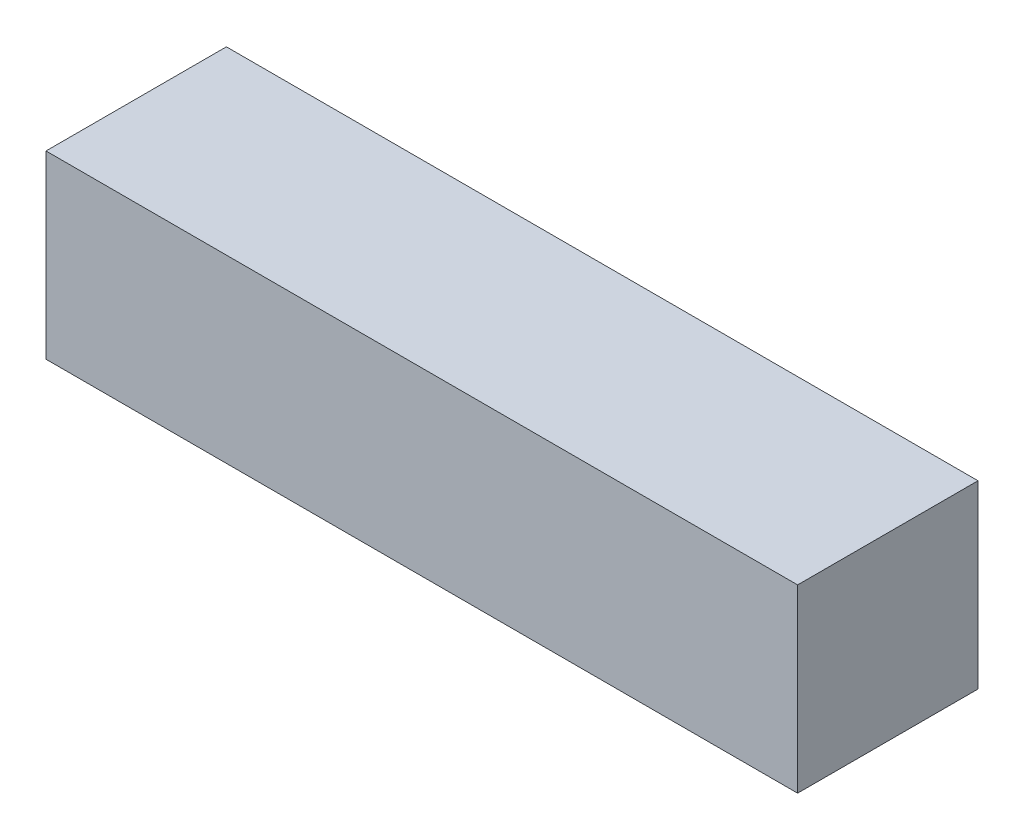
ISO-10303-21;
HEADER;
FILE_DESCRIPTION(('STEP AP214'),'2;1');
FILE_NAME('part.step','',(''),(''),'','','');
FILE_SCHEMA(('AUTOMOTIVE_DESIGN { 1 0 10303 214 1 1 1 1 }'));
ENDSEC;
DATA;
#1=APPLICATION_CONTEXT('core data for automotive mechanical design processes');
#2=APPLICATION_PROTOCOL_DEFINITION('international standard','automotive_design',2000,#1);
#3=PRODUCT_CONTEXT('',#1,'mechanical');
#4=PRODUCT('Part','Part','',(#3));
#5=PRODUCT_RELATED_PRODUCT_CATEGORY('part','',(#4));
#6=PRODUCT_DEFINITION_FORMATION('','',#4);
#7=PRODUCT_DEFINITION_CONTEXT('part definition',#1,'design');
#8=PRODUCT_DEFINITION('design','',#6,#7);
#9=PRODUCT_DEFINITION_SHAPE('','',#8);
#10=(LENGTH_UNIT() NAMED_UNIT(*) SI_UNIT(.MILLI.,.METRE.));
#11=(NAMED_UNIT(*) PLANE_ANGLE_UNIT() SI_UNIT($,.RADIAN.));
#12=(NAMED_UNIT(*) SI_UNIT($,.STERADIAN.) SOLID_ANGLE_UNIT());
#13=UNCERTAINTY_MEASURE_WITH_UNIT(LENGTH_MEASURE(1.E-05),#10,'distance_accuracy_value','');
#14=(GEOMETRIC_REPRESENTATION_CONTEXT(3) GLOBAL_UNCERTAINTY_ASSIGNED_CONTEXT((#13)) GLOBAL_UNIT_ASSIGNED_CONTEXT((#10,
#11,#12)) REPRESENTATION_CONTEXT('',''));
#15=CARTESIAN_POINT('',(0.,0.,0.));
#16=DIRECTION('',(0.,0.,1.));
#17=DIRECTION('',(1.,0.,0.));
#18=AXIS2_PLACEMENT_3D('',#15,#16,#17);
#19=CARTESIAN_POINT('',(0.,30.,0.));
#20=DIRECTION('',(1.,0.,0.));
#21=DIRECTION('',(0.,0.,-1.));
#22=AXIS2_PLACEMENT_3D('',#19,#20,#21);
#23=PLANE('',#22);
#24=DIRECTION('',(0.,0.,1.));
#25=VECTOR('',#24,1.);
#26=CARTESIAN_POINT('',(0.,0.,0.));
#27=LINE('',#26,#25);
#28=CARTESIAN_POINT('',(0.,0.,-30.));
#29=VERTEX_POINT('',#28);
#30=CARTESIAN_POINT('',(0.,0.,0.));
#31=VERTEX_POINT('',#30);
#32=EDGE_CURVE('E96',#29,#31,#27,.T.);
#33=ORIENTED_EDGE('',*,*,#32,.T.);
#34=DIRECTION('',(0.,-1.,0.));
#35=VECTOR('',#34,1.);
#36=CARTESIAN_POINT('',(0.,30.,0.));
#37=LINE('',#36,#35);
#38=CARTESIAN_POINT('',(0.,30.,0.));
#39=VERTEX_POINT('',#38);
#40=EDGE_CURVE('E11',#39,#31,#37,.T.);
#41=ORIENTED_EDGE('',*,*,#40,.F.);
#42=DIRECTION('',(0.,0.,1.));
#43=VECTOR('',#42,1.);
#44=CARTESIAN_POINT('',(0.,30.,0.));
#45=LINE('',#44,#43);
#46=CARTESIAN_POINT('',(0.,30.,-30.));
#47=VERTEX_POINT('',#46);
#48=EDGE_CURVE('E84',#47,#39,#45,.T.);
#49=ORIENTED_EDGE('',*,*,#48,.F.);
#50=DIRECTION('',(0.,-1.,0.));
#51=VECTOR('',#50,1.);
#52=CARTESIAN_POINT('',(0.,30.,-30.));
#53=LINE('',#52,#51);
#54=EDGE_CURVE('E92',#47,#29,#53,.T.);
#55=ORIENTED_EDGE('',*,*,#54,.T.);
#56=EDGE_LOOP('',(#33,#41,#49,#55));
#57=FACE_BOUND('',#56,.T.);
#58=ADVANCED_FACE('F33',(#57),#23,.F.);
#59=CARTESIAN_POINT('',(0.,30.,0.));
#60=DIRECTION('',(0.,0.,-1.));
#61=DIRECTION('',(-1.,0.,0.));
#62=AXIS2_PLACEMENT_3D('',#59,#60,#61);
#63=PLANE('',#62);
#64=DIRECTION('',(1.,0.,0.));
#65=VECTOR('',#64,1.);
#66=CARTESIAN_POINT('',(0.,0.,0.));
#67=LINE('',#66,#65);
#68=CARTESIAN_POINT('',(125.,0.,0.));
#69=VERTEX_POINT('',#68);
#70=EDGE_CURVE('E88',#31,#69,#67,.T.);
#71=ORIENTED_EDGE('',*,*,#70,.T.);
#72=DIRECTION('',(0.,-1.,0.));
#73=VECTOR('',#72,1.);
#74=CARTESIAN_POINT('',(125.,30.,0.));
#75=LINE('',#74,#73);
#76=CARTESIAN_POINT('',(125.,30.,0.));
#77=VERTEX_POINT('',#76);
#78=EDGE_CURVE('E41',#77,#69,#75,.T.);
#79=ORIENTED_EDGE('',*,*,#78,.F.);
#80=DIRECTION('',(1.,0.,0.));
#81=VECTOR('',#80,1.);
#82=CARTESIAN_POINT('',(0.,30.,0.));
#83=LINE('',#82,#81);
#84=EDGE_CURVE('E79',#39,#77,#83,.T.);
#85=ORIENTED_EDGE('',*,*,#84,.F.);
#86=ORIENTED_EDGE('',*,*,#40,.T.);
#87=EDGE_LOOP('',(#71,#79,#85,#86));
#88=FACE_BOUND('',#87,.T.);
#89=ADVANCED_FACE('F87',(#88),#63,.F.);
#90=CARTESIAN_POINT('',(125.,30.,0.));
#91=DIRECTION('',(-1.,0.,0.));
#92=DIRECTION('',(0.,0.,1.));
#93=AXIS2_PLACEMENT_3D('',#90,#91,#92);
#94=PLANE('',#93);
#95=DIRECTION('',(0.,0.,-1.));
#96=VECTOR('',#95,1.);
#97=CARTESIAN_POINT('',(125.,0.,0.));
#98=LINE('',#97,#96);
#99=CARTESIAN_POINT('',(125.,0.,-30.));
#100=VERTEX_POINT('',#99);
#101=EDGE_CURVE('E66',#69,#100,#98,.T.);
#102=ORIENTED_EDGE('',*,*,#101,.T.);
#103=DIRECTION('',(0.,-1.,0.));
#104=VECTOR('',#103,1.);
#105=CARTESIAN_POINT('',(125.,30.,-30.));
#106=LINE('',#105,#104);
#107=CARTESIAN_POINT('',(125.,30.,-30.));
#108=VERTEX_POINT('',#107);
#109=EDGE_CURVE('E89',#108,#100,#106,.T.);
#110=ORIENTED_EDGE('',*,*,#109,.F.);
#111=DIRECTION('',(0.,0.,-1.));
#112=VECTOR('',#111,1.);
#113=CARTESIAN_POINT('',(125.,30.,0.));
#114=LINE('',#113,#112);
#115=EDGE_CURVE('E82',#77,#108,#114,.T.);
#116=ORIENTED_EDGE('',*,*,#115,.F.);
#117=ORIENTED_EDGE('',*,*,#78,.T.);
#118=EDGE_LOOP('',(#102,#110,#116,#117));
#119=FACE_BOUND('',#118,.T.);
#120=ADVANCED_FACE('F90',(#119),#94,.F.);
#121=CARTESIAN_POINT('',(0.,30.,-30.));
#122=DIRECTION('',(0.,0.,1.));
#123=DIRECTION('',(1.,0.,0.));
#124=AXIS2_PLACEMENT_3D('',#121,#122,#123);
#125=PLANE('',#124);
#126=DIRECTION('',(-1.,0.,0.));
#127=VECTOR('',#126,1.);
#128=CARTESIAN_POINT('',(0.,0.,-30.));
#129=LINE('',#128,#127);
#130=EDGE_CURVE('E72',#100,#29,#129,.T.);
#131=ORIENTED_EDGE('',*,*,#130,.T.);
#132=ORIENTED_EDGE('',*,*,#54,.F.);
#133=DIRECTION('',(-1.,0.,0.));
#134=VECTOR('',#133,1.);
#135=CARTESIAN_POINT('',(0.,30.,-30.));
#136=LINE('',#135,#134);
#137=EDGE_CURVE('E49',#108,#47,#136,.T.);
#138=ORIENTED_EDGE('',*,*,#137,.F.);
#139=ORIENTED_EDGE('',*,*,#109,.T.);
#140=EDGE_LOOP('',(#131,#132,#138,#139));
#141=FACE_BOUND('',#140,.T.);
#142=ADVANCED_FACE('F103',(#141),#125,.F.);
#143=CARTESIAN_POINT('',(0.,30.,0.));
#144=DIRECTION('',(0.,-1.,0.));
#145=DIRECTION('',(0.,0.,-1.));
#146=AXIS2_PLACEMENT_3D('',#143,#144,#145);
#147=PLANE('',#146);
#148=ORIENTED_EDGE('',*,*,#48,.T.);
#149=ORIENTED_EDGE('',*,*,#84,.T.);
#150=ORIENTED_EDGE('',*,*,#115,.T.);
#151=ORIENTED_EDGE('',*,*,#137,.T.);
#152=EDGE_LOOP('',(#148,#149,#150,#151));
#153=FACE_BOUND('',#152,.T.);
#154=ADVANCED_FACE('F80',(#153),#147,.F.);
#155=CARTESIAN_POINT('',(0.,0.,0.));
#156=DIRECTION('',(0.,-1.,0.));
#157=DIRECTION('',(0.,0.,-1.));
#158=AXIS2_PLACEMENT_3D('',#155,#156,#157);
#159=PLANE('',#158);
#160=ORIENTED_EDGE('',*,*,#32,.F.);
#161=ORIENTED_EDGE('',*,*,#130,.F.);
#162=ORIENTED_EDGE('',*,*,#101,.F.);
#163=ORIENTED_EDGE('',*,*,#70,.F.);
#164=EDGE_LOOP('',(#160,#161,#162,#163));
#165=FACE_BOUND('',#164,.T.);
#166=ADVANCED_FACE('F106',(#165),#159,.T.);
#167=CLOSED_SHELL('',(#58,#89,#120,#142,#154,#166));
#168=MANIFOLD_SOLID_BREP('B2',#167);
#169=ADVANCED_BREP_SHAPE_REPRESENTATION('',(#18,#168),#14);
#170=SHAPE_DEFINITION_REPRESENTATION(#9,#169);
ENDSEC;
END-ISO-10303-21;
